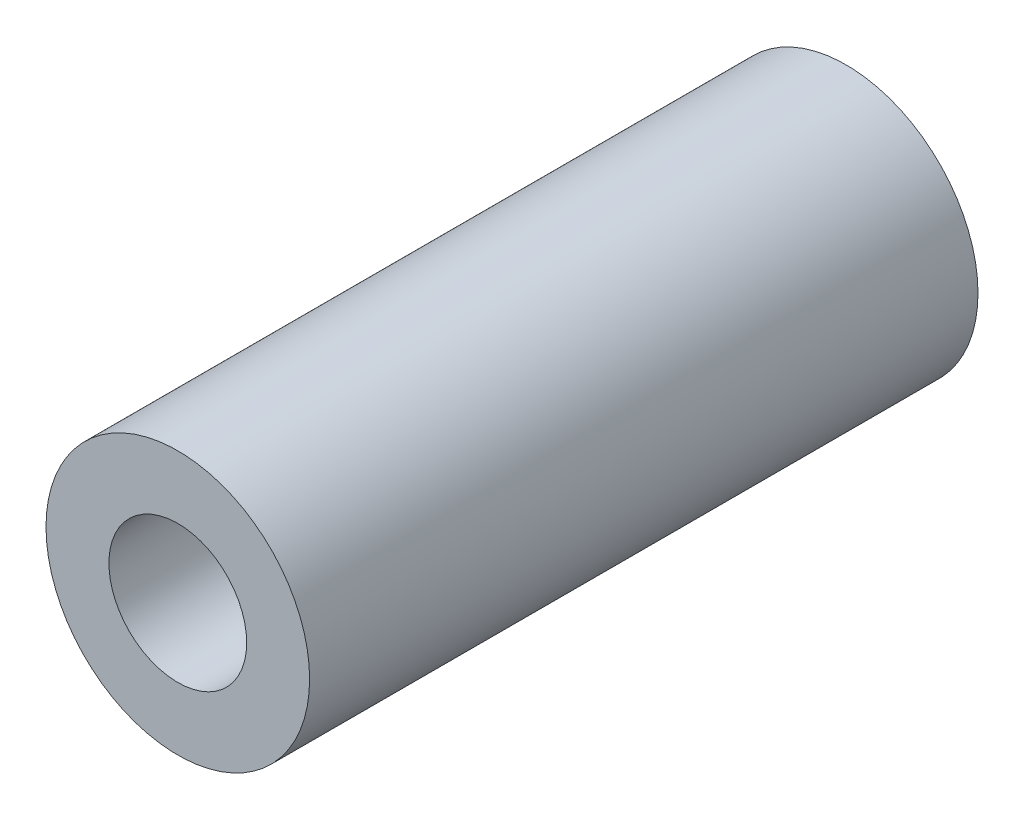
ISO-10303-21;
HEADER;
FILE_DESCRIPTION(('STEP AP214'),'2;1');
FILE_NAME('part.step','',(''),(''),'','','');
FILE_SCHEMA(('AUTOMOTIVE_DESIGN { 1 0 10303 214 1 1 1 1 }'));
ENDSEC;
DATA;
#1=APPLICATION_CONTEXT('core data for automotive mechanical design processes');
#2=APPLICATION_PROTOCOL_DEFINITION('international standard','automotive_design',2000,#1);
#3=PRODUCT_CONTEXT('',#1,'mechanical');
#4=PRODUCT('Part','Part','',(#3));
#5=PRODUCT_RELATED_PRODUCT_CATEGORY('part','',(#4));
#6=PRODUCT_DEFINITION_FORMATION('','',#4);
#7=PRODUCT_DEFINITION_CONTEXT('part definition',#1,'design');
#8=PRODUCT_DEFINITION('design','',#6,#7);
#9=PRODUCT_DEFINITION_SHAPE('','',#8);
#10=(LENGTH_UNIT() NAMED_UNIT(*) SI_UNIT(.MILLI.,.METRE.));
#11=(NAMED_UNIT(*) PLANE_ANGLE_UNIT() SI_UNIT($,.RADIAN.));
#12=(NAMED_UNIT(*) SI_UNIT($,.STERADIAN.) SOLID_ANGLE_UNIT());
#13=UNCERTAINTY_MEASURE_WITH_UNIT(LENGTH_MEASURE(1.E-05),#10,'distance_accuracy_value','');
#14=(GEOMETRIC_REPRESENTATION_CONTEXT(3) GLOBAL_UNCERTAINTY_ASSIGNED_CONTEXT((#13)) GLOBAL_UNIT_ASSIGNED_CONTEXT((#10,
#11,#12)) REPRESENTATION_CONTEXT('',''));
#15=CARTESIAN_POINT('',(0.,0.,0.));
#16=DIRECTION('',(0.,0.,1.));
#17=DIRECTION('',(1.,0.,0.));
#18=AXIS2_PLACEMENT_3D('',#15,#16,#17);
#19=CARTESIAN_POINT('',(0.,0.,12.07516));
#20=DIRECTION('',(0.,0.,1.));
#21=DIRECTION('',(1.,0.,0.));
#22=AXIS2_PLACEMENT_3D('',#19,#20,#21);
#23=PLANE('',#22);
#24=CARTESIAN_POINT('',(0.,0.,12.07516));
#25=DIRECTION('',(0.,0.,1.));
#26=DIRECTION('',(1.,0.,0.));
#27=AXIS2_PLACEMENT_3D('',#24,#25,#26);
#28=CIRCLE('',#27,4.7625);
#29=CARTESIAN_POINT('',(4.7625,0.,12.07516));
#30=VERTEX_POINT('',#29);
#31=EDGE_CURVE('E11',#30,#30,#28,.T.);
#32=ORIENTED_EDGE('',*,*,#31,.T.);
#33=EDGE_LOOP('',(#32));
#34=FACE_BOUND('',#33,.T.);
#35=CARTESIAN_POINT('',(0.,0.,12.07516));
#36=DIRECTION('',(0.,0.,1.));
#37=DIRECTION('',(1.,0.,0.));
#38=AXIS2_PLACEMENT_3D('',#35,#36,#37);
#39=CIRCLE('',#38,2.4892);
#40=CARTESIAN_POINT('',(2.4892,0.,12.07516));
#41=VERTEX_POINT('',#40);
#42=EDGE_CURVE('E62',#41,#41,#39,.T.);
#43=ORIENTED_EDGE('',*,*,#42,.F.);
#44=EDGE_LOOP('',(#43));
#45=FACE_BOUND('',#44,.T.);
#46=ADVANCED_FACE('F49',(#34,#45),#23,.T.);
#47=CARTESIAN_POINT('',(0.,0.,-12.07516));
#48=DIRECTION('',(0.,0.,1.));
#49=DIRECTION('',(1.,0.,0.));
#50=AXIS2_PLACEMENT_3D('',#47,#48,#49);
#51=PLANE('',#50);
#52=CARTESIAN_POINT('',(0.,0.,-12.07516));
#53=DIRECTION('',(0.,0.,1.));
#54=DIRECTION('',(1.,0.,0.));
#55=AXIS2_PLACEMENT_3D('',#52,#53,#54);
#56=CIRCLE('',#55,4.7625);
#57=CARTESIAN_POINT('',(4.7625,0.,-12.07516));
#58=VERTEX_POINT('',#57);
#59=EDGE_CURVE('E53',#58,#58,#56,.T.);
#60=ORIENTED_EDGE('',*,*,#59,.F.);
#61=EDGE_LOOP('',(#60));
#62=FACE_BOUND('',#61,.T.);
#63=CARTESIAN_POINT('',(0.,0.,-12.07516));
#64=DIRECTION('',(0.,0.,1.));
#65=DIRECTION('',(1.,0.,0.));
#66=AXIS2_PLACEMENT_3D('',#63,#64,#65);
#67=CIRCLE('',#66,2.4892);
#68=CARTESIAN_POINT('',(2.4892,0.,-12.07516));
#69=VERTEX_POINT('',#68);
#70=EDGE_CURVE('E64',#69,#69,#67,.T.);
#71=ORIENTED_EDGE('',*,*,#70,.T.);
#72=EDGE_LOOP('',(#71));
#73=FACE_BOUND('',#72,.T.);
#74=ADVANCED_FACE('F76',(#62,#73),#51,.F.);
#75=CARTESIAN_POINT('',(0.,0.,12.07516));
#76=DIRECTION('',(0.,0.,-1.));
#77=DIRECTION('',(-1.,0.,0.));
#78=AXIS2_PLACEMENT_3D('',#75,#76,#77);
#79=CYLINDRICAL_SURFACE('',#78,4.7625);
#80=ORIENTED_EDGE('',*,*,#31,.F.);
#81=EDGE_LOOP('',(#80));
#82=FACE_BOUND('',#81,.T.);
#83=ORIENTED_EDGE('',*,*,#59,.T.);
#84=EDGE_LOOP('',(#83));
#85=FACE_BOUND('',#84,.T.);
#86=ADVANCED_FACE('F51',(#82,#85),#79,.T.);
#87=CARTESIAN_POINT('',(0.,0.,12.07516));
#88=DIRECTION('',(0.,0.,-1.));
#89=DIRECTION('',(-1.,0.,0.));
#90=AXIS2_PLACEMENT_3D('',#87,#88,#89);
#91=CYLINDRICAL_SURFACE('',#90,2.4892);
#92=ORIENTED_EDGE('',*,*,#42,.T.);
#93=EDGE_LOOP('',(#92));
#94=FACE_BOUND('',#93,.T.);
#95=ORIENTED_EDGE('',*,*,#70,.F.);
#96=EDGE_LOOP('',(#95));
#97=FACE_BOUND('',#96,.T.);
#98=ADVANCED_FACE('F72',(#94,#97),#91,.F.);
#99=CLOSED_SHELL('',(#46,#74,#86,#98));
#100=MANIFOLD_SOLID_BREP('B2',#99);
#101=ADVANCED_BREP_SHAPE_REPRESENTATION('',(#18,#100),#14);
#102=SHAPE_DEFINITION_REPRESENTATION(#9,#101);
ENDSEC;
END-ISO-10303-21;
